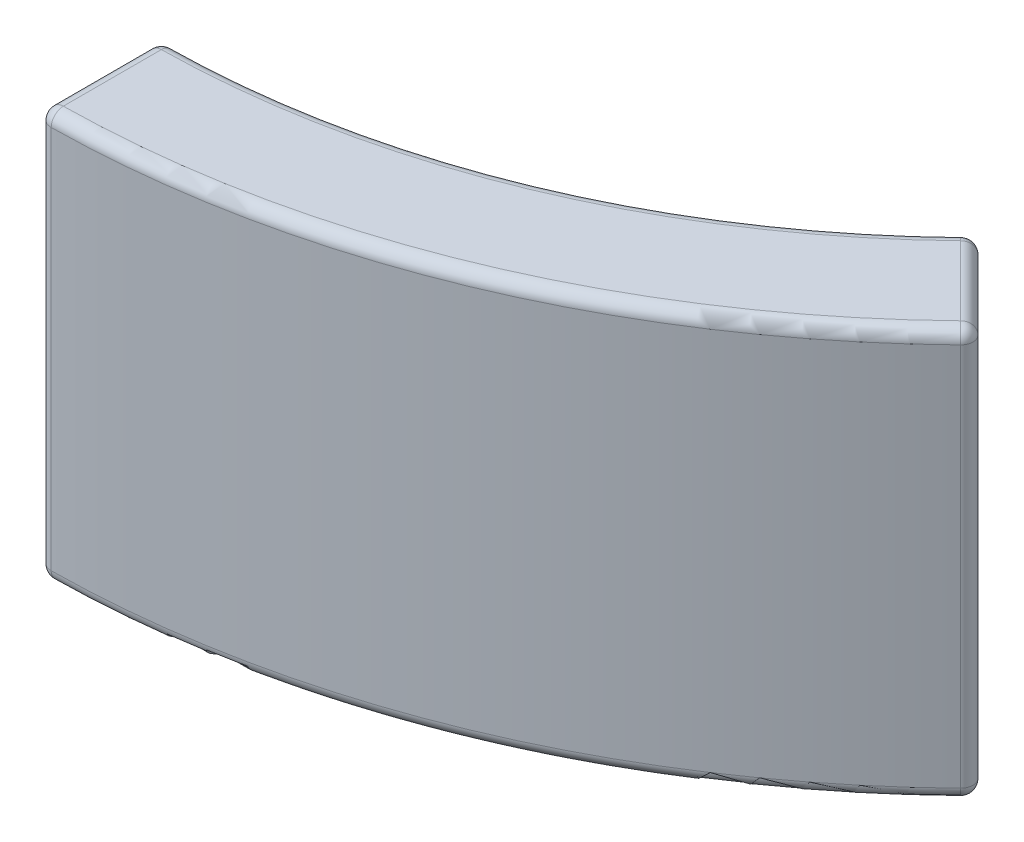
ISO-10303-21;
HEADER;
FILE_DESCRIPTION(('STEP AP214'),'2;1');
FILE_NAME('part.step','',(''),(''),'','','');
FILE_SCHEMA(('AUTOMOTIVE_DESIGN { 1 0 10303 214 1 1 1 1 }'));
ENDSEC;
DATA;
#1=APPLICATION_CONTEXT('core data for automotive mechanical design processes');
#2=APPLICATION_PROTOCOL_DEFINITION('international standard','automotive_design',2000,#1);
#3=PRODUCT_CONTEXT('',#1,'mechanical');
#4=PRODUCT('Part','Part','',(#3));
#5=PRODUCT_RELATED_PRODUCT_CATEGORY('part','',(#4));
#6=PRODUCT_DEFINITION_FORMATION('','',#4);
#7=PRODUCT_DEFINITION_CONTEXT('part definition',#1,'design');
#8=PRODUCT_DEFINITION('design','',#6,#7);
#9=PRODUCT_DEFINITION_SHAPE('','',#8);
#10=(LENGTH_UNIT() NAMED_UNIT(*) SI_UNIT(.MILLI.,.METRE.));
#11=(NAMED_UNIT(*) PLANE_ANGLE_UNIT() SI_UNIT($,.RADIAN.));
#12=(NAMED_UNIT(*) SI_UNIT($,.STERADIAN.) SOLID_ANGLE_UNIT());
#13=UNCERTAINTY_MEASURE_WITH_UNIT(LENGTH_MEASURE(1.E-05),#10,'distance_accuracy_value','');
#14=(GEOMETRIC_REPRESENTATION_CONTEXT(3) GLOBAL_UNCERTAINTY_ASSIGNED_CONTEXT((#13)) GLOBAL_UNIT_ASSIGNED_CONTEXT((#10,
#11,#12)) REPRESENTATION_CONTEXT('',''));
#15=CARTESIAN_POINT('',(0.,0.,0.));
#16=DIRECTION('',(0.,0.,1.));
#17=DIRECTION('',(1.,0.,0.));
#18=AXIS2_PLACEMENT_3D('',#15,#16,#17);
#19=CARTESIAN_POINT('',(0.,10.,0.));
#20=DIRECTION('',(0.,-1.,0.));
#21=DIRECTION('',(0.,0.,-1.));
#22=AXIS2_PLACEMENT_3D('',#19,#20,#21);
#23=CYLINDRICAL_SURFACE('',#22,20.);
#24=CARTESIAN_POINT('',(0.,9.7,0.));
#25=DIRECTION('',(0.,1.,0.));
#26=DIRECTION('',(0.,0.,1.));
#27=AXIS2_PLACEMENT_3D('',#24,#25,#26);
#28=CIRCLE('',#27,20.);
#29=CARTESIAN_POINT('',(0.295566502463054,9.7,19.9978158918073));
#30=VERTEX_POINT('',#29);
#31=CARTESIAN_POINT('',(13.9315941478339,9.7,14.3495883042003));
#32=VERTEX_POINT('',#31);
#33=EDGE_CURVE('E177',#30,#32,#28,.T.);
#34=ORIENTED_EDGE('',*,*,#33,.T.);
#35=DIRECTION('',(0.,-1.,0.));
#36=VECTOR('',#35,1.);
#37=CARTESIAN_POINT('',(13.9315941478339,10.,14.3495883042003));
#38=LINE('',#37,#36);
#39=CARTESIAN_POINT('',(13.9315941478339,0.3,14.3495883042003));
#40=VERTEX_POINT('',#39);
#41=EDGE_CURVE('E183',#32,#40,#38,.T.);
#42=ORIENTED_EDGE('',*,*,#41,.T.);
#43=CARTESIAN_POINT('',(0.,0.3,0.));
#44=DIRECTION('',(0.,1.,0.));
#45=DIRECTION('',(0.,0.,1.));
#46=AXIS2_PLACEMENT_3D('',#43,#44,#45);
#47=CIRCLE('',#46,20.);
#48=CARTESIAN_POINT('',(0.295566502463054,0.3,19.9978158918073));
#49=VERTEX_POINT('',#48);
#50=EDGE_CURVE('E181',#40,#49,#47,.F.);
#51=ORIENTED_EDGE('',*,*,#50,.T.);
#52=DIRECTION('',(0.,-1.,0.));
#53=VECTOR('',#52,1.);
#54=CARTESIAN_POINT('',(0.295566502463054,10.,19.9978158918073));
#55=LINE('',#54,#53);
#56=EDGE_CURVE('E179',#49,#30,#55,.F.);
#57=ORIENTED_EDGE('',*,*,#56,.T.);
#58=EDGE_LOOP('',(#34,#42,#51,#57));
#59=FACE_BOUND('',#58,.T.);
#60=ADVANCED_FACE('F37',(#59),#23,.F.);
#61=CARTESIAN_POINT('',(0.,10.,20.));
#62=DIRECTION('',(1.,0.,0.));
#63=DIRECTION('',(0.,0.,-1.));
#64=AXIS2_PLACEMENT_3D('',#61,#62,#63);
#65=PLANE('',#64);
#66=DIRECTION('',(0.,0.,1.));
#67=VECTOR('',#66,1.);
#68=CARTESIAN_POINT('',(0.,9.7,20.));
#69=LINE('',#68,#67);
#70=CARTESIAN_POINT('',(0.,9.7,22.6980175345778));
#71=VERTEX_POINT('',#70);
#72=CARTESIAN_POINT('',(0.,9.7,20.2977831301844));
#73=VERTEX_POINT('',#72);
#74=EDGE_CURVE('E188',#71,#73,#69,.F.);
#75=ORIENTED_EDGE('',*,*,#74,.T.);
#76=DIRECTION('',(0.,-1.,0.));
#77=VECTOR('',#76,1.);
#78=CARTESIAN_POINT('',(0.,10.,20.2977831301844));
#79=LINE('',#78,#77);
#80=CARTESIAN_POINT('',(0.,0.3,20.2977831301844));
#81=VERTEX_POINT('',#80);
#82=EDGE_CURVE('E192',#73,#81,#79,.T.);
#83=ORIENTED_EDGE('',*,*,#82,.T.);
#84=DIRECTION('',(0.,0.,1.));
#85=VECTOR('',#84,1.);
#86=CARTESIAN_POINT('',(0.,0.3,20.));
#87=LINE('',#86,#85);
#88=CARTESIAN_POINT('',(0.,0.3,22.6980175345778));
#89=VERTEX_POINT('',#88);
#90=EDGE_CURVE('E190',#81,#89,#87,.T.);
#91=ORIENTED_EDGE('',*,*,#90,.T.);
#92=DIRECTION('',(0.,-1.,0.));
#93=VECTOR('',#92,1.);
#94=CARTESIAN_POINT('',(0.,10.,22.6980175345778));
#95=LINE('',#94,#93);
#96=EDGE_CURVE('E186',#89,#71,#95,.F.);
#97=ORIENTED_EDGE('',*,*,#96,.T.);
#98=EDGE_LOOP('',(#75,#83,#91,#97));
#99=FACE_BOUND('',#98,.T.);
#100=ADVANCED_FACE('F276',(#99),#65,.F.);
#101=CARTESIAN_POINT('',(0.,10.,0.));
#102=DIRECTION('',(0.,-1.,0.));
#103=DIRECTION('',(0.,0.,-1.));
#104=AXIS2_PLACEMENT_3D('',#101,#102,#103);
#105=CYLINDRICAL_SURFACE('',#104,23.);
#106=CARTESIAN_POINT('',(0.,9.7,0.));
#107=DIRECTION('',(0.,1.,0.));
#108=DIRECTION('',(0.,0.,1.));
#109=AXIS2_PLACEMENT_3D('',#106,#107,#108);
#110=CIRCLE('',#109,23.);
#111=CARTESIAN_POINT('',(16.0471000849431,9.7,16.4769711677789));
#112=VERTEX_POINT('',#111);
#113=CARTESIAN_POINT('',(0.303964757709251,9.7,22.9979913345942));
#114=VERTEX_POINT('',#113);
#115=EDGE_CURVE('E46',#112,#114,#110,.F.);
#116=ORIENTED_EDGE('',*,*,#115,.T.);
#117=DIRECTION('',(0.,-1.,0.));
#118=VECTOR('',#117,1.);
#119=CARTESIAN_POINT('',(0.303964757709251,10.,22.9979913345942));
#120=LINE('',#119,#118);
#121=CARTESIAN_POINT('',(0.303964757709251,0.3,22.9979913345942));
#122=VERTEX_POINT('',#121);
#123=EDGE_CURVE('E11',#114,#122,#120,.T.);
#124=ORIENTED_EDGE('',*,*,#123,.T.);
#125=CARTESIAN_POINT('',(0.,0.3,0.));
#126=DIRECTION('',(0.,1.,0.));
#127=DIRECTION('',(0.,0.,1.));
#128=AXIS2_PLACEMENT_3D('',#125,#126,#127);
#129=CIRCLE('',#128,23.);
#130=CARTESIAN_POINT('',(16.0471000849431,0.3,16.4769711677789));
#131=VERTEX_POINT('',#130);
#132=EDGE_CURVE('E202',#122,#131,#129,.T.);
#133=ORIENTED_EDGE('',*,*,#132,.T.);
#134=DIRECTION('',(0.,-1.,0.));
#135=VECTOR('',#134,1.);
#136=CARTESIAN_POINT('',(16.0471000849431,10.,16.4769711677789));
#137=LINE('',#136,#135);
#138=EDGE_CURVE('E57',#131,#112,#137,.F.);
#139=ORIENTED_EDGE('',*,*,#138,.T.);
#140=EDGE_LOOP('',(#116,#124,#133,#139));
#141=FACE_BOUND('',#140,.T.);
#142=ADVANCED_FACE('F289',(#141),#105,.T.);
#143=CARTESIAN_POINT('',(14.142135623731,10.,14.1421356237309));
#144=DIRECTION('',(-0.707106781186546,0.,0.707106781186549));
#145=DIRECTION('',(0.707106781186549,0.,0.707106781186546));
#146=AXIS2_PLACEMENT_3D('',#143,#144,#145);
#147=PLANE('',#146);
#148=DIRECTION('',(0.,-1.,0.));
#149=VECTOR('',#148,1.);
#150=CARTESIAN_POINT('',(16.0499221181911,10.,16.0499221181911));
#151=LINE('',#150,#149);
#152=CARTESIAN_POINT('',(16.0499221181911,9.7,16.0499221181911));
#153=VERTEX_POINT('',#152);
#154=CARTESIAN_POINT('',(16.0499221181911,0.3,16.0499221181911));
#155=VERTEX_POINT('',#154);
#156=EDGE_CURVE('E129',#153,#155,#151,.T.);
#157=ORIENTED_EDGE('',*,*,#156,.T.);
#158=DIRECTION('',(-0.707106781186549,0.,-0.707106781186546));
#159=VECTOR('',#158,1.);
#160=CARTESIAN_POINT('',(14.142135623731,0.3,14.1421356237309));
#161=LINE('',#160,#159);
#162=CARTESIAN_POINT('',(14.3527000944074,0.3,14.3527000944073));
#163=VERTEX_POINT('',#162);
#164=EDGE_CURVE('E166',#155,#163,#161,.T.);
#165=ORIENTED_EDGE('',*,*,#164,.T.);
#166=DIRECTION('',(0.,-1.,0.));
#167=VECTOR('',#166,1.);
#168=CARTESIAN_POINT('',(14.3527000944074,10.,14.3527000944073));
#169=LINE('',#168,#167);
#170=CARTESIAN_POINT('',(14.3527000944074,9.7,14.3527000944073));
#171=VERTEX_POINT('',#170);
#172=EDGE_CURVE('E132',#163,#171,#169,.F.);
#173=ORIENTED_EDGE('',*,*,#172,.T.);
#174=DIRECTION('',(-0.707106781186549,0.,-0.707106781186546));
#175=VECTOR('',#174,1.);
#176=CARTESIAN_POINT('',(16.2634559672906,9.7,16.2634559672906));
#177=LINE('',#176,#175);
#178=EDGE_CURVE('E124',#171,#153,#177,.F.);
#179=ORIENTED_EDGE('',*,*,#178,.T.);
#180=EDGE_LOOP('',(#157,#165,#173,#179));
#181=FACE_BOUND('',#180,.T.);
#182=ADVANCED_FACE('F126',(#181),#147,.F.);
#183=CARTESIAN_POINT('',(0.,10.,0.));
#184=DIRECTION('',(0.,1.,0.));
#185=DIRECTION('',(0.,0.,1.));
#186=AXIS2_PLACEMENT_3D('',#183,#184,#185);
#187=PLANE('',#186);
#188=DIRECTION('',(-0.707106781186549,0.,-0.707106781186546));
#189=VECTOR('',#188,1.);
#190=CARTESIAN_POINT('',(13.930003589375,10.,14.3542676580869));
#191=LINE('',#190,#189);
#192=CARTESIAN_POINT('',(15.8377900838352,10.,16.262054152547));
#193=VERTEX_POINT('',#192);
#194=CARTESIAN_POINT('',(14.1405680600514,10.,14.5648321287633));
#195=VERTEX_POINT('',#194);
#196=EDGE_CURVE('E143',#193,#195,#191,.T.);
#197=ORIENTED_EDGE('',*,*,#196,.T.);
#198=CARTESIAN_POINT('',(0.,10.,0.));
#199=DIRECTION('',(0.,1.,0.));
#200=DIRECTION('',(0.,0.,1.));
#201=AXIS2_PLACEMENT_3D('',#198,#199,#200);
#202=CIRCLE('',#201,20.3);
#203=CARTESIAN_POINT('',(0.3,10.,20.2977831301844));
#204=VERTEX_POINT('',#203);
#205=EDGE_CURVE('E200',#195,#204,#202,.F.);
#206=ORIENTED_EDGE('',*,*,#205,.T.);
#207=DIRECTION('',(0.,0.,1.));
#208=VECTOR('',#207,1.);
#209=CARTESIAN_POINT('',(0.3,10.,23.));
#210=LINE('',#209,#208);
#211=CARTESIAN_POINT('',(0.3,10.,22.6980175345778));
#212=VERTEX_POINT('',#211);
#213=EDGE_CURVE('E197',#204,#212,#210,.T.);
#214=ORIENTED_EDGE('',*,*,#213,.T.);
#215=CARTESIAN_POINT('',(0.,10.,0.));
#216=DIRECTION('',(0.,1.,0.));
#217=DIRECTION('',(0.,0.,1.));
#218=AXIS2_PLACEMENT_3D('',#215,#216,#217);
#219=CIRCLE('',#218,22.7);
#220=EDGE_CURVE('E195',#212,#193,#219,.T.);
#221=ORIENTED_EDGE('',*,*,#220,.T.);
#222=EDGE_LOOP('',(#197,#206,#214,#221));
#223=FACE_BOUND('',#222,.T.);
#224=ADVANCED_FACE('F481',(#223),#187,.T.);
#225=CARTESIAN_POINT('',(0.,0.,0.));
#226=DIRECTION('',(0.,1.,0.));
#227=DIRECTION('',(0.,0.,1.));
#228=AXIS2_PLACEMENT_3D('',#225,#226,#227);
#229=PLANE('',#228);
#230=CARTESIAN_POINT('',(0.,0.,0.));
#231=DIRECTION('',(0.,1.,0.));
#232=DIRECTION('',(0.,0.,1.));
#233=AXIS2_PLACEMENT_3D('',#230,#231,#232);
#234=CIRCLE('',#233,20.3);
#235=CARTESIAN_POINT('',(0.3,0.,20.2977831301844));
#236=VERTEX_POINT('',#235);
#237=CARTESIAN_POINT('',(14.1405680600514,0.,14.5648321287633));
#238=VERTEX_POINT('',#237);
#239=EDGE_CURVE('E172',#236,#238,#234,.T.);
#240=ORIENTED_EDGE('',*,*,#239,.T.);
#241=DIRECTION('',(-0.707106781186549,0.,-0.707106781186546));
#242=VECTOR('',#241,1.);
#243=CARTESIAN_POINT('',(-0.212132034355972,0.,0.21213203435597));
#244=LINE('',#243,#242);
#245=CARTESIAN_POINT('',(15.8377900838352,0.,16.262054152547));
#246=VERTEX_POINT('',#245);
#247=EDGE_CURVE('E174',#238,#246,#244,.F.);
#248=ORIENTED_EDGE('',*,*,#247,.T.);
#249=CARTESIAN_POINT('',(0.,0.,0.));
#250=DIRECTION('',(0.,1.,0.));
#251=DIRECTION('',(0.,0.,1.));
#252=AXIS2_PLACEMENT_3D('',#249,#250,#251);
#253=CIRCLE('',#252,22.7);
#254=CARTESIAN_POINT('',(0.3,0.,22.6980175345778));
#255=VERTEX_POINT('',#254);
#256=EDGE_CURVE('E168',#246,#255,#253,.F.);
#257=ORIENTED_EDGE('',*,*,#256,.T.);
#258=DIRECTION('',(0.,0.,1.));
#259=VECTOR('',#258,1.);
#260=CARTESIAN_POINT('',(0.299999999999997,0.,0.));
#261=LINE('',#260,#259);
#262=EDGE_CURVE('E170',#255,#236,#261,.F.);
#263=ORIENTED_EDGE('',*,*,#262,.T.);
#264=EDGE_LOOP('',(#240,#248,#257,#263));
#265=FACE_BOUND('',#264,.T.);
#266=ADVANCED_FACE('F474',(#265),#229,.F.);
#267=CARTESIAN_POINT('',(0.299999999999997,9.7,0.));
#268=DIRECTION('',(0.,0.,-1.));
#269=DIRECTION('',(-1.,0.,0.));
#270=AXIS2_PLACEMENT_3D('',#267,#268,#269);
#271=CYLINDRICAL_SURFACE('',#270,0.3);
#272=CARTESIAN_POINT('',(0.3,9.7,22.6980175345778));
#273=DIRECTION('',(0.,0.,1.));
#274=DIRECTION('',(1.,0.,0.));
#275=AXIS2_PLACEMENT_3D('',#272,#273,#274);
#276=CIRCLE('',#275,0.3);
#277=EDGE_CURVE('E41',#212,#71,#276,.T.);
#278=ORIENTED_EDGE('',*,*,#277,.F.);
#279=ORIENTED_EDGE('',*,*,#213,.F.);
#280=CARTESIAN_POINT('',(0.3,9.7,20.2977831301844));
#281=DIRECTION('',(0.,0.,-1.));
#282=DIRECTION('',(0.,1.,0.));
#283=AXIS2_PLACEMENT_3D('',#280,#281,#282);
#284=CIRCLE('',#283,0.3);
#285=EDGE_CURVE('E163',#73,#204,#284,.T.);
#286=ORIENTED_EDGE('',*,*,#285,.F.);
#287=ORIENTED_EDGE('',*,*,#74,.F.);
#288=EDGE_LOOP('',(#278,#279,#286,#287));
#289=FACE_BOUND('',#288,.T.);
#290=ADVANCED_FACE('F39',(#289),#271,.T.);
#291=CARTESIAN_POINT('',(0.3,9.7,22.6980175345778));
#292=DIRECTION('',(0.,0.,1.));
#293=DIRECTION('',(1.,0.,0.));
#294=AXIS2_PLACEMENT_3D('',#291,#292,#293);
#295=SPHERICAL_SURFACE('',#294,0.3);
#296=CARTESIAN_POINT('',(0.3,9.7,22.6980175345778));
#297=DIRECTION('',(-0.999912666721488,0.,0.013215859030837));
#298=DIRECTION('',(0.013215859030837,0.,0.999912666721488));
#299=AXIS2_PLACEMENT_3D('',#296,#297,#298);
#300=CIRCLE('',#299,0.3);
#301=EDGE_CURVE('E247',#212,#114,#300,.F.);
#302=ORIENTED_EDGE('',*,*,#301,.F.);
#303=ORIENTED_EDGE('',*,*,#277,.T.);
#304=CARTESIAN_POINT('',(0.3,9.7,22.6980175345778));
#305=DIRECTION('',(0.,1.,0.));
#306=DIRECTION('',(0.,0.,1.));
#307=AXIS2_PLACEMENT_3D('',#304,#305,#306);
#308=CIRCLE('',#307,0.3);
#309=EDGE_CURVE('E249',#114,#71,#308,.F.);
#310=ORIENTED_EDGE('',*,*,#309,.F.);
#311=EDGE_LOOP('',(#302,#303,#310));
#312=FACE_BOUND('',#311,.T.);
#313=ADVANCED_FACE('F282',(#312),#295,.T.);
#314=CARTESIAN_POINT('',(0.3,9.7,20.2977831301844));
#315=DIRECTION('',(0.,0.,1.));
#316=DIRECTION('',(1.,0.,0.));
#317=AXIS2_PLACEMENT_3D('',#314,#315,#316);
#318=SPHERICAL_SURFACE('',#317,0.3);
#319=CARTESIAN_POINT('',(0.3,9.7,20.2977831301844));
#320=DIRECTION('',(0.,1.,0.));
#321=DIRECTION('',(0.,0.,1.));
#322=AXIS2_PLACEMENT_3D('',#319,#320,#321);
#323=CIRCLE('',#322,0.3);
#324=EDGE_CURVE('E241',#73,#30,#323,.F.);
#325=ORIENTED_EDGE('',*,*,#324,.F.);
#326=ORIENTED_EDGE('',*,*,#285,.T.);
#327=CARTESIAN_POINT('',(0.3,9.7,20.2977831301844));
#328=DIRECTION('',(-0.999890794590366,0.,0.014778325123153));
#329=DIRECTION('',(0.014778325123153,0.,0.999890794590366));
#330=AXIS2_PLACEMENT_3D('',#327,#328,#329);
#331=CIRCLE('',#330,0.3);
#332=EDGE_CURVE('E244',#30,#204,#331,.F.);
#333=ORIENTED_EDGE('',*,*,#332,.F.);
#334=EDGE_LOOP('',(#325,#326,#333));
#335=FACE_BOUND('',#334,.T.);
#336=ADVANCED_FACE('F256',(#335),#318,.T.);
#337=CARTESIAN_POINT('',(0.3,10.,22.6980175345778));
#338=DIRECTION('',(0.,-1.,0.));
#339=DIRECTION('',(0.,0.,-1.));
#340=AXIS2_PLACEMENT_3D('',#337,#338,#339);
#341=CYLINDRICAL_SURFACE('',#340,0.3);
#342=ORIENTED_EDGE('',*,*,#309,.T.);
#343=ORIENTED_EDGE('',*,*,#96,.F.);
#344=CARTESIAN_POINT('',(0.3,0.3,22.6980175345778));
#345=DIRECTION('',(0.,-1.,0.));
#346=DIRECTION('',(0.,0.,-1.));
#347=AXIS2_PLACEMENT_3D('',#344,#345,#346);
#348=CIRCLE('',#347,0.3);
#349=EDGE_CURVE('E235',#122,#89,#348,.T.);
#350=ORIENTED_EDGE('',*,*,#349,.F.);
#351=ORIENTED_EDGE('',*,*,#123,.F.);
#352=EDGE_LOOP('',(#342,#343,#350,#351));
#353=FACE_BOUND('',#352,.T.);
#354=ADVANCED_FACE('F286',(#353),#341,.T.);
#355=CARTESIAN_POINT('',(0.,9.7,0.));
#356=DIRECTION('',(0.,1.,0.));
#357=DIRECTION('',(0.,0.,1.));
#358=AXIS2_PLACEMENT_3D('',#355,#356,#357);
#359=TOROIDAL_SURFACE('',#358,22.7,0.3);
#360=ORIENTED_EDGE('',*,*,#301,.T.);
#361=ORIENTED_EDGE('',*,*,#115,.F.);
#362=CARTESIAN_POINT('',(15.8377900838352,9.7,16.262054152547));
#363=DIRECTION('',(0.716390050772999,0.,-0.697700003693178));
#364=DIRECTION('',(-0.697700003693178,0.,-0.716390050772999));
#365=AXIS2_PLACEMENT_3D('',#362,#363,#364);
#366=CIRCLE('',#365,0.3);
#367=EDGE_CURVE('E147',#193,#112,#366,.T.);
#368=ORIENTED_EDGE('',*,*,#367,.F.);
#369=ORIENTED_EDGE('',*,*,#220,.F.);
#370=EDGE_LOOP('',(#360,#361,#368,#369));
#371=FACE_BOUND('',#370,.T.);
#372=ADVANCED_FACE('F438',(#371),#359,.T.);
#373=CARTESIAN_POINT('',(-0.212132034355973,9.7,0.212132034355971));
#374=DIRECTION('',(0.707106781186549,0.,0.707106781186546));
#375=DIRECTION('',(0.707106781186546,0.,-0.707106781186549));
#376=AXIS2_PLACEMENT_3D('',#373,#374,#375);
#377=CYLINDRICAL_SURFACE('',#376,0.3);
#378=CARTESIAN_POINT('',(14.1405680600514,9.7,14.5648321287633));
#379=DIRECTION('',(-0.707106781186545,0.,-0.70710678118655));
#380=DIRECTION('',(-0.70710678118655,0.,0.707106781186545));
#381=AXIS2_PLACEMENT_3D('',#378,#379,#380);
#382=CIRCLE('',#381,0.3);
#383=EDGE_CURVE('E148',#195,#171,#382,.T.);
#384=ORIENTED_EDGE('',*,*,#383,.F.);
#385=ORIENTED_EDGE('',*,*,#196,.F.);
#386=CARTESIAN_POINT('',(15.8377900838352,9.7,16.262054152547));
#387=DIRECTION('',(0.707106781186553,0.,0.707106781186542));
#388=DIRECTION('',(0.707106781186542,0.,-0.707106781186553));
#389=AXIS2_PLACEMENT_3D('',#386,#387,#388);
#390=CIRCLE('',#389,0.3);
#391=EDGE_CURVE('E139',#153,#193,#390,.T.);
#392=ORIENTED_EDGE('',*,*,#391,.F.);
#393=ORIENTED_EDGE('',*,*,#178,.F.);
#394=EDGE_LOOP('',(#384,#385,#392,#393));
#395=FACE_BOUND('',#394,.T.);
#396=ADVANCED_FACE('F141',(#395),#377,.T.);
#397=CARTESIAN_POINT('',(0.,9.7,0.));
#398=DIRECTION('',(0.,1.,0.));
#399=DIRECTION('',(0.,0.,1.));
#400=AXIS2_PLACEMENT_3D('',#397,#398,#399);
#401=TOROIDAL_SURFACE('',#400,20.3,0.3);
#402=ORIENTED_EDGE('',*,*,#332,.T.);
#403=ORIENTED_EDGE('',*,*,#205,.F.);
#404=CARTESIAN_POINT('',(14.1405680600514,9.7,14.5648321287633));
#405=DIRECTION('',(0.717479415210013,0.,-0.696579707391694));
#406=DIRECTION('',(-0.696579707391694,0.,-0.717479415210013));
#407=AXIS2_PLACEMENT_3D('',#404,#405,#406);
#408=CIRCLE('',#407,0.3);
#409=EDGE_CURVE('E231',#32,#195,#408,.T.);
#410=ORIENTED_EDGE('',*,*,#409,.F.);
#411=ORIENTED_EDGE('',*,*,#33,.F.);
#412=EDGE_LOOP('',(#402,#403,#410,#411));
#413=FACE_BOUND('',#412,.T.);
#414=ADVANCED_FACE('F264',(#413),#401,.T.);
#415=CARTESIAN_POINT('',(0.3,10.,20.2977831301844));
#416=DIRECTION('',(0.,-1.,0.));
#417=DIRECTION('',(0.,0.,-1.));
#418=AXIS2_PLACEMENT_3D('',#415,#416,#417);
#419=CYLINDRICAL_SURFACE('',#418,0.3);
#420=ORIENTED_EDGE('',*,*,#324,.T.);
#421=ORIENTED_EDGE('',*,*,#56,.F.);
#422=CARTESIAN_POINT('',(0.3,0.3,20.2977831301844));
#423=DIRECTION('',(0.,-1.,0.));
#424=DIRECTION('',(0.,0.,-1.));
#425=AXIS2_PLACEMENT_3D('',#422,#423,#424);
#426=CIRCLE('',#425,0.3);
#427=EDGE_CURVE('E228',#81,#49,#426,.T.);
#428=ORIENTED_EDGE('',*,*,#427,.F.);
#429=ORIENTED_EDGE('',*,*,#82,.F.);
#430=EDGE_LOOP('',(#420,#421,#428,#429));
#431=FACE_BOUND('',#430,.T.);
#432=ADVANCED_FACE('F273',(#431),#419,.T.);
#433=CARTESIAN_POINT('',(0.3,0.3,20.));
#434=DIRECTION('',(0.,0.,1.));
#435=DIRECTION('',(1.,0.,0.));
#436=AXIS2_PLACEMENT_3D('',#433,#434,#435);
#437=CYLINDRICAL_SURFACE('',#436,0.3);
#438=CARTESIAN_POINT('',(0.3,0.3,22.6980175345778));
#439=DIRECTION('',(0.,0.,1.));
#440=DIRECTION('',(1.,0.,0.));
#441=AXIS2_PLACEMENT_3D('',#438,#439,#440);
#442=CIRCLE('',#441,0.3);
#443=EDGE_CURVE('E238',#89,#255,#442,.T.);
#444=ORIENTED_EDGE('',*,*,#443,.F.);
#445=ORIENTED_EDGE('',*,*,#90,.F.);
#446=CARTESIAN_POINT('',(0.3,0.3,20.2977831301844));
#447=DIRECTION('',(0.,0.,-1.));
#448=DIRECTION('',(-1.,0.,0.));
#449=AXIS2_PLACEMENT_3D('',#446,#447,#448);
#450=CIRCLE('',#449,0.3);
#451=EDGE_CURVE('E226',#236,#81,#450,.T.);
#452=ORIENTED_EDGE('',*,*,#451,.F.);
#453=ORIENTED_EDGE('',*,*,#262,.F.);
#454=EDGE_LOOP('',(#444,#445,#452,#453));
#455=FACE_BOUND('',#454,.T.);
#456=ADVANCED_FACE('F407',(#455),#437,.T.);
#457=CARTESIAN_POINT('',(0.3,0.3,22.6980175345778));
#458=DIRECTION('',(0.,0.,1.));
#459=DIRECTION('',(1.,0.,0.));
#460=AXIS2_PLACEMENT_3D('',#457,#458,#459);
#461=SPHERICAL_SURFACE('',#460,0.3);
#462=ORIENTED_EDGE('',*,*,#349,.T.);
#463=ORIENTED_EDGE('',*,*,#443,.T.);
#464=CARTESIAN_POINT('',(0.3,0.3,22.6980175345778));
#465=DIRECTION('',(-0.999912666721488,0.,0.0132158590308371));
#466=DIRECTION('',(0.0132158590308371,0.,0.999912666721488));
#467=AXIS2_PLACEMENT_3D('',#464,#465,#466);
#468=CIRCLE('',#467,0.3);
#469=EDGE_CURVE('E154',#122,#255,#468,.F.);
#470=ORIENTED_EDGE('',*,*,#469,.F.);
#471=EDGE_LOOP('',(#462,#463,#470));
#472=FACE_BOUND('',#471,.T.);
#473=ADVANCED_FACE('F319',(#472),#461,.T.);
#474=CARTESIAN_POINT('',(15.8377900838352,9.7,16.262054152547));
#475=DIRECTION('',(0.,0.,1.));
#476=DIRECTION('',(1.,0.,0.));
#477=AXIS2_PLACEMENT_3D('',#474,#475,#476);
#478=SPHERICAL_SURFACE('',#477,0.3);
#479=ORIENTED_EDGE('',*,*,#391,.T.);
#480=ORIENTED_EDGE('',*,*,#367,.T.);
#481=CARTESIAN_POINT('',(15.8377900838352,9.7,16.262054152547));
#482=DIRECTION('',(0.,1.,0.));
#483=DIRECTION('',(0.,0.,1.));
#484=AXIS2_PLACEMENT_3D('',#481,#482,#483);
#485=CIRCLE('',#484,0.3);
#486=EDGE_CURVE('E151',#153,#112,#485,.F.);
#487=ORIENTED_EDGE('',*,*,#486,.F.);
#488=EDGE_LOOP('',(#479,#480,#487));
#489=FACE_BOUND('',#488,.T.);
#490=ADVANCED_FACE('F152',(#489),#478,.T.);
#491=CARTESIAN_POINT('',(14.1405680600514,9.7,14.5648321287633));
#492=DIRECTION('',(0.,0.,1.));
#493=DIRECTION('',(1.,0.,0.));
#494=AXIS2_PLACEMENT_3D('',#491,#492,#493);
#495=SPHERICAL_SURFACE('',#494,0.3);
#496=ORIENTED_EDGE('',*,*,#409,.T.);
#497=ORIENTED_EDGE('',*,*,#383,.T.);
#498=CARTESIAN_POINT('',(14.1405680600514,9.7,14.5648321287633));
#499=DIRECTION('',(0.,1.,0.));
#500=DIRECTION('',(0.,0.,1.));
#501=AXIS2_PLACEMENT_3D('',#498,#499,#500);
#502=CIRCLE('',#501,0.3);
#503=EDGE_CURVE('E155',#32,#171,#502,.F.);
#504=ORIENTED_EDGE('',*,*,#503,.F.);
#505=EDGE_LOOP('',(#496,#497,#504));
#506=FACE_BOUND('',#505,.T.);
#507=ADVANCED_FACE('F309',(#506),#495,.T.);
#508=CARTESIAN_POINT('',(0.3,0.3,20.2977831301844));
#509=DIRECTION('',(0.,0.,1.));
#510=DIRECTION('',(1.,0.,0.));
#511=AXIS2_PLACEMENT_3D('',#508,#509,#510);
#512=SPHERICAL_SURFACE('',#511,0.3);
#513=ORIENTED_EDGE('',*,*,#451,.T.);
#514=ORIENTED_EDGE('',*,*,#427,.T.);
#515=CARTESIAN_POINT('',(0.3,0.3,20.2977831301844));
#516=DIRECTION('',(-0.999890794590366,0.,0.0147783251231528));
#517=DIRECTION('',(0.0147783251231528,0.,0.999890794590366));
#518=AXIS2_PLACEMENT_3D('',#515,#516,#517);
#519=CIRCLE('',#518,0.3);
#520=EDGE_CURVE('E219',#236,#49,#519,.F.);
#521=ORIENTED_EDGE('',*,*,#520,.F.);
#522=EDGE_LOOP('',(#513,#514,#521));
#523=FACE_BOUND('',#522,.T.);
#524=ADVANCED_FACE('F311',(#523),#512,.T.);
#525=CARTESIAN_POINT('',(0.,0.3,0.));
#526=DIRECTION('',(0.,1.,0.));
#527=DIRECTION('',(0.,0.,1.));
#528=AXIS2_PLACEMENT_3D('',#525,#526,#527);
#529=TOROIDAL_SURFACE('',#528,22.7,0.3);
#530=ORIENTED_EDGE('',*,*,#469,.T.);
#531=ORIENTED_EDGE('',*,*,#256,.F.);
#532=CARTESIAN_POINT('',(15.8377900838352,0.3,16.262054152547));
#533=DIRECTION('',(0.716390050772993,0.,-0.697700003693184));
#534=DIRECTION('',(-0.697700003693184,0.,-0.716390050772993));
#535=AXIS2_PLACEMENT_3D('',#532,#533,#534);
#536=CIRCLE('',#535,0.3);
#537=EDGE_CURVE('E216',#131,#246,#536,.T.);
#538=ORIENTED_EDGE('',*,*,#537,.F.);
#539=ORIENTED_EDGE('',*,*,#132,.F.);
#540=EDGE_LOOP('',(#530,#531,#538,#539));
#541=FACE_BOUND('',#540,.T.);
#542=ADVANCED_FACE('F294',(#541),#529,.T.);
#543=CARTESIAN_POINT('',(15.8377900838352,10.,16.262054152547));
#544=DIRECTION('',(0.,-1.,0.));
#545=DIRECTION('',(0.,0.,-1.));
#546=AXIS2_PLACEMENT_3D('',#543,#544,#545);
#547=CYLINDRICAL_SURFACE('',#546,0.3);
#548=ORIENTED_EDGE('',*,*,#486,.T.);
#549=ORIENTED_EDGE('',*,*,#138,.F.);
#550=CARTESIAN_POINT('',(15.8377900838352,0.3,16.262054152547));
#551=DIRECTION('',(0.,-1.,0.));
#552=DIRECTION('',(0.,0.,-1.));
#553=AXIS2_PLACEMENT_3D('',#550,#551,#552);
#554=CIRCLE('',#553,0.3);
#555=EDGE_CURVE('E159',#155,#131,#554,.T.);
#556=ORIENTED_EDGE('',*,*,#555,.F.);
#557=ORIENTED_EDGE('',*,*,#156,.F.);
#558=EDGE_LOOP('',(#548,#549,#556,#557));
#559=FACE_BOUND('',#558,.T.);
#560=ADVANCED_FACE('F157',(#559),#547,.T.);
#561=CARTESIAN_POINT('',(14.1405680600514,10.,14.5648321287633));
#562=DIRECTION('',(0.,-1.,0.));
#563=DIRECTION('',(0.,0.,-1.));
#564=AXIS2_PLACEMENT_3D('',#561,#562,#563);
#565=CYLINDRICAL_SURFACE('',#564,0.3);
#566=ORIENTED_EDGE('',*,*,#503,.T.);
#567=ORIENTED_EDGE('',*,*,#172,.F.);
#568=CARTESIAN_POINT('',(14.1405680600514,0.3,14.5648321287633));
#569=DIRECTION('',(0.,-1.,0.));
#570=DIRECTION('',(0.,0.,-1.));
#571=AXIS2_PLACEMENT_3D('',#568,#569,#570);
#572=CIRCLE('',#571,0.3);
#573=EDGE_CURVE('E212',#40,#163,#572,.T.);
#574=ORIENTED_EDGE('',*,*,#573,.F.);
#575=ORIENTED_EDGE('',*,*,#41,.F.);
#576=EDGE_LOOP('',(#566,#567,#574,#575));
#577=FACE_BOUND('',#576,.T.);
#578=ADVANCED_FACE('F307',(#577),#565,.T.);
#579=CARTESIAN_POINT('',(0.,0.3,0.));
#580=DIRECTION('',(0.,1.,0.));
#581=DIRECTION('',(0.,0.,1.));
#582=AXIS2_PLACEMENT_3D('',#579,#580,#581);
#583=TOROIDAL_SURFACE('',#582,20.3,0.3);
#584=ORIENTED_EDGE('',*,*,#520,.T.);
#585=ORIENTED_EDGE('',*,*,#50,.F.);
#586=CARTESIAN_POINT('',(14.1405680600514,0.3,14.5648321287633));
#587=DIRECTION('',(0.717479415210007,0.,-0.6965797073917));
#588=DIRECTION('',(-0.6965797073917,0.,-0.717479415210007));
#589=AXIS2_PLACEMENT_3D('',#586,#587,#588);
#590=CIRCLE('',#589,0.3);
#591=EDGE_CURVE('E210',#238,#40,#590,.T.);
#592=ORIENTED_EDGE('',*,*,#591,.F.);
#593=ORIENTED_EDGE('',*,*,#239,.F.);
#594=EDGE_LOOP('',(#584,#585,#592,#593));
#595=FACE_BOUND('',#594,.T.);
#596=ADVANCED_FACE('F335',(#595),#583,.T.);
#597=CARTESIAN_POINT('',(15.8377900838352,0.3,16.262054152547));
#598=DIRECTION('',(0.,0.,1.));
#599=DIRECTION('',(1.,0.,0.));
#600=AXIS2_PLACEMENT_3D('',#597,#598,#599);
#601=SPHERICAL_SURFACE('',#600,0.3);
#602=ORIENTED_EDGE('',*,*,#555,.T.);
#603=ORIENTED_EDGE('',*,*,#537,.T.);
#604=CARTESIAN_POINT('',(15.8377900838352,0.3,16.262054152547));
#605=DIRECTION('',(0.707106781186542,0.,0.707106781186553));
#606=DIRECTION('',(0.707106781186553,0.,-0.707106781186542));
#607=AXIS2_PLACEMENT_3D('',#604,#605,#606);
#608=CIRCLE('',#607,0.3);
#609=EDGE_CURVE('E208',#155,#246,#608,.F.);
#610=ORIENTED_EDGE('',*,*,#609,.F.);
#611=EDGE_LOOP('',(#602,#603,#610));
#612=FACE_BOUND('',#611,.T.);
#613=ADVANCED_FACE('F296',(#612),#601,.T.);
#614=CARTESIAN_POINT('',(14.1405680600514,0.3,14.5648321287633));
#615=DIRECTION('',(0.,0.,1.));
#616=DIRECTION('',(1.,0.,0.));
#617=AXIS2_PLACEMENT_3D('',#614,#615,#616);
#618=SPHERICAL_SURFACE('',#617,0.3);
#619=ORIENTED_EDGE('',*,*,#591,.T.);
#620=ORIENTED_EDGE('',*,*,#573,.T.);
#621=CARTESIAN_POINT('',(14.1405680600514,0.3,14.5648321287633));
#622=DIRECTION('',(-0.707106781186548,0.,-0.707106781186548));
#623=DIRECTION('',(-0.707106781186548,0.,0.707106781186548));
#624=AXIS2_PLACEMENT_3D('',#621,#622,#623);
#625=CIRCLE('',#624,0.3);
#626=EDGE_CURVE('E206',#238,#163,#625,.F.);
#627=ORIENTED_EDGE('',*,*,#626,.F.);
#628=EDGE_LOOP('',(#619,#620,#627));
#629=FACE_BOUND('',#628,.T.);
#630=ADVANCED_FACE('F304',(#629),#618,.T.);
#631=CARTESIAN_POINT('',(13.930003589375,0.3,14.3542676580869));
#632=DIRECTION('',(-0.707106781186549,0.,-0.707106781186546));
#633=DIRECTION('',(-0.707106781186546,0.,0.707106781186549));
#634=AXIS2_PLACEMENT_3D('',#631,#632,#633);
#635=CYLINDRICAL_SURFACE('',#634,0.3);
#636=ORIENTED_EDGE('',*,*,#609,.T.);
#637=ORIENTED_EDGE('',*,*,#247,.F.);
#638=ORIENTED_EDGE('',*,*,#626,.T.);
#639=ORIENTED_EDGE('',*,*,#164,.F.);
#640=EDGE_LOOP('',(#636,#637,#638,#639));
#641=FACE_BOUND('',#640,.T.);
#642=ADVANCED_FACE('F300',(#641),#635,.T.);
#643=CLOSED_SHELL('',(#60,#100,#142,#182,#224,#266,#290,#313,#336,#354,#372,#396,#414,#432,#456,
#473,#490,#507,#524,#542,#560,#578,#596,#613,#630,#642));
#644=MANIFOLD_SOLID_BREP('B2',#643);
#645=ADVANCED_BREP_SHAPE_REPRESENTATION('',(#18,#644),#14);
#646=SHAPE_DEFINITION_REPRESENTATION(#9,#645);
ENDSEC;
END-ISO-10303-21;
